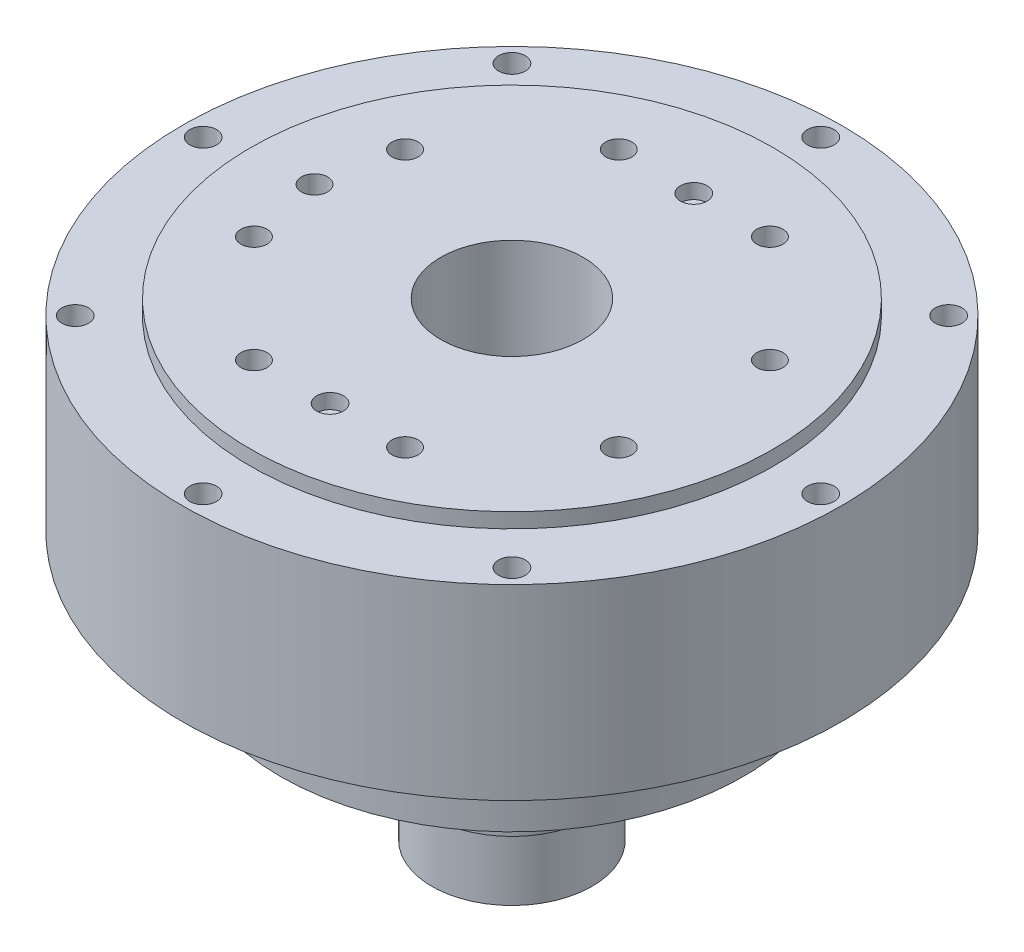
ISO-10303-21;
HEADER;
FILE_DESCRIPTION(('STEP AP214'),'2;1');
FILE_NAME('part.step','',(''),(''),'','','');
FILE_SCHEMA(('AUTOMOTIVE_DESIGN { 1 0 10303 214 1 1 1 1 }'));
ENDSEC;
DATA;
#1=APPLICATION_CONTEXT('core data for automotive mechanical design processes');
#2=APPLICATION_PROTOCOL_DEFINITION('international standard','automotive_design',2000,#1);
#3=PRODUCT_CONTEXT('',#1,'mechanical');
#4=PRODUCT('Part','Part','',(#3));
#5=PRODUCT_RELATED_PRODUCT_CATEGORY('part','',(#4));
#6=PRODUCT_DEFINITION_FORMATION('','',#4);
#7=PRODUCT_DEFINITION_CONTEXT('part definition',#1,'design');
#8=PRODUCT_DEFINITION('design','',#6,#7);
#9=PRODUCT_DEFINITION_SHAPE('','',#8);
#10=(LENGTH_UNIT() NAMED_UNIT(*) SI_UNIT(.MILLI.,.METRE.));
#11=(NAMED_UNIT(*) PLANE_ANGLE_UNIT() SI_UNIT($,.RADIAN.));
#12=(NAMED_UNIT(*) SI_UNIT($,.STERADIAN.) SOLID_ANGLE_UNIT());
#13=UNCERTAINTY_MEASURE_WITH_UNIT(LENGTH_MEASURE(1.E-05),#10,'distance_accuracy_value','');
#14=(GEOMETRIC_REPRESENTATION_CONTEXT(3) GLOBAL_UNCERTAINTY_ASSIGNED_CONTEXT((#13)) GLOBAL_UNIT_ASSIGNED_CONTEXT((#10,
#11,#12)) REPRESENTATION_CONTEXT('',''));
#15=CARTESIAN_POINT('',(0.,0.,0.));
#16=DIRECTION('',(0.,0.,1.));
#17=DIRECTION('',(1.,0.,0.));
#18=AXIS2_PLACEMENT_3D('',#15,#16,#17);
#19=CARTESIAN_POINT('',(0.,0.,0.));
#20=DIRECTION('',(0.,1.,0.));
#21=DIRECTION('',(0.,0.,1.));
#22=AXIS2_PLACEMENT_3D('',#19,#20,#21);
#23=PLANE('',#22);
#24=CARTESIAN_POINT('',(0.,0.,0.));
#25=DIRECTION('',(0.,-1.,0.));
#26=DIRECTION('',(0.,0.,-1.));
#27=AXIS2_PLACEMENT_3D('',#24,#25,#26);
#28=CIRCLE('',#27,24.);
#29=CARTESIAN_POINT('',(0.,0.,-24.));
#30=VERTEX_POINT('',#29);
#31=EDGE_CURVE('E213',#30,#30,#28,.T.);
#32=ORIENTED_EDGE('',*,*,#31,.F.);
#33=EDGE_LOOP('',(#32));
#34=FACE_BOUND('',#33,.T.);
#35=CARTESIAN_POINT('',(0.,0.,0.));
#36=DIRECTION('',(0.,-1.,0.));
#37=DIRECTION('',(0.,0.,-1.));
#38=AXIS2_PLACEMENT_3D('',#35,#36,#37);
#39=CIRCLE('',#38,27.);
#40=CARTESIAN_POINT('',(0.,0.,-27.));
#41=VERTEX_POINT('',#40);
#42=EDGE_CURVE('E10',#41,#41,#39,.T.);
#43=ORIENTED_EDGE('',*,*,#42,.T.);
#44=EDGE_LOOP('',(#43));
#45=FACE_BOUND('',#44,.T.);
#46=ADVANCED_FACE('F37',(#34,#45),#23,.F.);
#47=CARTESIAN_POINT('',(0.,0.,0.));
#48=DIRECTION('',(0.,-1.,0.));
#49=DIRECTION('',(0.,0.,-1.));
#50=AXIS2_PLACEMENT_3D('',#47,#48,#49);
#51=CYLINDRICAL_SURFACE('',#50,27.);
#52=ORIENTED_EDGE('',*,*,#42,.F.);
#53=EDGE_LOOP('',(#52));
#54=FACE_BOUND('',#53,.T.);
#55=CARTESIAN_POINT('',(0.,20.5,0.));
#56=DIRECTION('',(0.,-1.,0.));
#57=DIRECTION('',(0.,0.,-1.));
#58=AXIS2_PLACEMENT_3D('',#55,#56,#57);
#59=CIRCLE('',#58,27.);
#60=CARTESIAN_POINT('',(0.,20.5,-27.));
#61=VERTEX_POINT('',#60);
#62=EDGE_CURVE('E43',#61,#61,#59,.T.);
#63=ORIENTED_EDGE('',*,*,#62,.T.);
#64=EDGE_LOOP('',(#63));
#65=FACE_BOUND('',#64,.T.);
#66=ADVANCED_FACE('F230',(#54,#65),#51,.T.);
#67=CARTESIAN_POINT('',(0.,20.5,27.));
#68=DIRECTION('',(0.,1.,0.));
#69=DIRECTION('',(0.,0.,1.));
#70=AXIS2_PLACEMENT_3D('',#67,#68,#69);
#71=PLANE('',#70);
#72=ORIENTED_EDGE('',*,*,#62,.F.);
#73=EDGE_LOOP('',(#72));
#74=FACE_BOUND('',#73,.T.);
#75=CARTESIAN_POINT('',(0.,20.5,0.));
#76=DIRECTION('',(0.,-1.,0.));
#77=DIRECTION('',(0.,0.,-1.));
#78=AXIS2_PLACEMENT_3D('',#75,#76,#77);
#79=CIRCLE('',#78,27.5);
#80=CARTESIAN_POINT('',(0.,20.5,-27.5));
#81=VERTEX_POINT('',#80);
#82=EDGE_CURVE('E47',#81,#81,#79,.T.);
#83=ORIENTED_EDGE('',*,*,#82,.T.);
#84=EDGE_LOOP('',(#83));
#85=FACE_BOUND('',#84,.T.);
#86=ADVANCED_FACE('F234',(#74,#85),#71,.F.);
#87=CARTESIAN_POINT('',(0.,0.,0.));
#88=DIRECTION('',(0.,-1.,0.));
#89=DIRECTION('',(0.,0.,-1.));
#90=AXIS2_PLACEMENT_3D('',#87,#88,#89);
#91=CYLINDRICAL_SURFACE('',#90,27.5);
#92=ORIENTED_EDGE('',*,*,#82,.F.);
#93=EDGE_LOOP('',(#92));
#94=FACE_BOUND('',#93,.T.);
#95=CARTESIAN_POINT('',(0.,45.55,0.));
#96=DIRECTION('',(0.,-1.,0.));
#97=DIRECTION('',(0.,0.,-1.));
#98=AXIS2_PLACEMENT_3D('',#95,#96,#97);
#99=CIRCLE('',#98,27.5);
#100=CARTESIAN_POINT('',(0.,45.55,-27.5));
#101=VERTEX_POINT('',#100);
#102=EDGE_CURVE('E51',#101,#101,#99,.T.);
#103=ORIENTED_EDGE('',*,*,#102,.T.);
#104=EDGE_LOOP('',(#103));
#105=FACE_BOUND('',#104,.T.);
#106=ADVANCED_FACE('F239',(#94,#105),#91,.T.);
#107=CARTESIAN_POINT('',(0.,45.55,27.5));
#108=DIRECTION('',(0.,1.,0.));
#109=DIRECTION('',(0.,0.,1.));
#110=AXIS2_PLACEMENT_3D('',#107,#108,#109);
#111=PLANE('',#110);
#112=ORIENTED_EDGE('',*,*,#102,.F.);
#113=EDGE_LOOP('',(#112));
#114=FACE_BOUND('',#113,.T.);
#115=CARTESIAN_POINT('',(0.,45.55,0.));
#116=DIRECTION('',(0.,-1.,0.));
#117=DIRECTION('',(0.,0.,-1.));
#118=AXIS2_PLACEMENT_3D('',#115,#116,#117);
#119=CIRCLE('',#118,42.5);
#120=CARTESIAN_POINT('',(0.,45.55,-42.5));
#121=VERTEX_POINT('',#120);
#122=EDGE_CURVE('E56',#121,#121,#119,.T.);
#123=ORIENTED_EDGE('',*,*,#122,.T.);
#124=EDGE_LOOP('',(#123));
#125=FACE_BOUND('',#124,.T.);
#126=ADVANCED_FACE('F245',(#114,#125),#111,.F.);
#127=CARTESIAN_POINT('',(0.,0.,0.));
#128=DIRECTION('',(0.,-1.,0.));
#129=DIRECTION('',(0.,0.,-1.));
#130=AXIS2_PLACEMENT_3D('',#127,#128,#129);
#131=CYLINDRICAL_SURFACE('',#130,42.5);
#132=ORIENTED_EDGE('',*,*,#122,.F.);
#133=EDGE_LOOP('',(#132));
#134=FACE_BOUND('',#133,.T.);
#135=CARTESIAN_POINT('',(0.,57.55,0.));
#136=DIRECTION('',(0.,-1.,0.));
#137=DIRECTION('',(0.,0.,-1.));
#138=AXIS2_PLACEMENT_3D('',#135,#136,#137);
#139=CIRCLE('',#138,42.5);
#140=CARTESIAN_POINT('',(0.,57.55,-42.5));
#141=VERTEX_POINT('',#140);
#142=EDGE_CURVE('E59',#141,#141,#139,.T.);
#143=ORIENTED_EDGE('',*,*,#142,.T.);
#144=EDGE_LOOP('',(#143));
#145=FACE_BOUND('',#144,.T.);
#146=ADVANCED_FACE('F249',(#134,#145),#131,.T.);
#147=CARTESIAN_POINT('',(0.,57.55,42.5));
#148=DIRECTION('',(0.,1.,0.));
#149=DIRECTION('',(0.,0.,1.));
#150=AXIS2_PLACEMENT_3D('',#147,#148,#149);
#151=PLANE('',#150);
#152=ORIENTED_EDGE('',*,*,#142,.F.);
#153=EDGE_LOOP('',(#152));
#154=FACE_BOUND('',#153,.T.);
#155=CARTESIAN_POINT('',(0.,57.55,0.));
#156=DIRECTION('',(0.,-1.,0.));
#157=DIRECTION('',(0.,0.,-1.));
#158=AXIS2_PLACEMENT_3D('',#155,#156,#157);
#159=CIRCLE('',#158,78.);
#160=CARTESIAN_POINT('',(0.,57.55,-78.));
#161=VERTEX_POINT('',#160);
#162=EDGE_CURVE('E62',#161,#161,#159,.T.);
#163=ORIENTED_EDGE('',*,*,#162,.T.);
#164=EDGE_LOOP('',(#163));
#165=FACE_BOUND('',#164,.T.);
#166=ADVANCED_FACE('F253',(#154,#165),#151,.F.);
#167=CARTESIAN_POINT('',(0.,0.,0.));
#168=DIRECTION('',(0.,-1.,0.));
#169=DIRECTION('',(0.,0.,-1.));
#170=AXIS2_PLACEMENT_3D('',#167,#168,#169);
#171=CYLINDRICAL_SURFACE('',#170,78.);
#172=ORIENTED_EDGE('',*,*,#162,.F.);
#173=EDGE_LOOP('',(#172));
#174=FACE_BOUND('',#173,.T.);
#175=CARTESIAN_POINT('',(0.,67.8430050880201,0.));
#176=DIRECTION('',(0.,-1.,0.));
#177=DIRECTION('',(0.,0.,-1.));
#178=AXIS2_PLACEMENT_3D('',#175,#176,#177);
#179=CIRCLE('',#178,78.);
#180=CARTESIAN_POINT('',(0.,67.8430050880201,-78.));
#181=VERTEX_POINT('',#180);
#182=EDGE_CURVE('E65',#181,#181,#179,.T.);
#183=ORIENTED_EDGE('',*,*,#182,.T.);
#184=EDGE_LOOP('',(#183));
#185=FACE_BOUND('',#184,.T.);
#186=ADVANCED_FACE('F257',(#174,#185),#171,.T.);
#187=CARTESIAN_POINT('',(0.,67.8430050880201,78.));
#188=DIRECTION('',(0.,-1.,0.));
#189=DIRECTION('',(0.,0.,-1.));
#190=AXIS2_PLACEMENT_3D('',#187,#188,#189);
#191=PLANE('',#190);
#192=ORIENTED_EDGE('',*,*,#182,.F.);
#193=EDGE_LOOP('',(#192));
#194=FACE_BOUND('',#193,.T.);
#195=CARTESIAN_POINT('',(0.,67.8430050880201,0.));
#196=DIRECTION('',(0.,-1.,0.));
#197=DIRECTION('',(0.,0.,-1.));
#198=AXIS2_PLACEMENT_3D('',#195,#196,#197);
#199=CIRCLE('',#198,42.9118558687993);
#200=CARTESIAN_POINT('',(0.,67.8430050880201,-42.9118558687993));
#201=VERTEX_POINT('',#200);
#202=EDGE_CURVE('E68',#201,#201,#199,.T.);
#203=ORIENTED_EDGE('',*,*,#202,.T.);
#204=EDGE_LOOP('',(#203));
#205=FACE_BOUND('',#204,.T.);
#206=ADVANCED_FACE('F261',(#194,#205),#191,.F.);
#207=CARTESIAN_POINT('',(0.,0.,0.));
#208=DIRECTION('',(0.,-1.,0.));
#209=DIRECTION('',(0.,0.,-1.));
#210=AXIS2_PLACEMENT_3D('',#207,#208,#209);
#211=CYLINDRICAL_SURFACE('',#210,42.9118558687993);
#212=ORIENTED_EDGE('',*,*,#202,.F.);
#213=EDGE_LOOP('',(#212));
#214=FACE_BOUND('',#213,.T.);
#215=CARTESIAN_POINT('',(0.,74.5688263856512,0.));
#216=DIRECTION('',(0.,-1.,0.));
#217=DIRECTION('',(0.,0.,-1.));
#218=AXIS2_PLACEMENT_3D('',#215,#216,#217);
#219=CIRCLE('',#218,42.9118558687993);
#220=CARTESIAN_POINT('',(0.,74.5688263856512,-42.9118558687993));
#221=VERTEX_POINT('',#220);
#222=EDGE_CURVE('E71',#221,#221,#219,.T.);
#223=ORIENTED_EDGE('',*,*,#222,.T.);
#224=EDGE_LOOP('',(#223));
#225=FACE_BOUND('',#224,.T.);
#226=ADVANCED_FACE('F265',(#214,#225),#211,.T.);
#227=CARTESIAN_POINT('',(0.,74.5688263856512,42.9118558687993));
#228=DIRECTION('',(0.,1.,0.));
#229=DIRECTION('',(0.,0.,1.));
#230=AXIS2_PLACEMENT_3D('',#227,#228,#229);
#231=PLANE('',#230);
#232=ORIENTED_EDGE('',*,*,#222,.F.);
#233=EDGE_LOOP('',(#232));
#234=FACE_BOUND('',#233,.T.);
#235=CARTESIAN_POINT('',(0.,74.5688263856512,0.));
#236=DIRECTION('',(0.,-1.,0.));
#237=DIRECTION('',(0.,0.,-1.));
#238=AXIS2_PLACEMENT_3D('',#235,#236,#237);
#239=CIRCLE('',#238,50.1462036607056);
#240=CARTESIAN_POINT('',(0.,74.5688263856512,-50.1462036607056));
#241=VERTEX_POINT('',#240);
#242=EDGE_CURVE('E74',#241,#241,#239,.T.);
#243=ORIENTED_EDGE('',*,*,#242,.T.);
#244=EDGE_LOOP('',(#243));
#245=FACE_BOUND('',#244,.T.);
#246=ADVANCED_FACE('F269',(#234,#245),#231,.F.);
#247=CARTESIAN_POINT('',(0.,0.,0.));
#248=DIRECTION('',(0.,-1.,0.));
#249=DIRECTION('',(0.,0.,-1.));
#250=AXIS2_PLACEMENT_3D('',#247,#248,#249);
#251=CYLINDRICAL_SURFACE('',#250,50.1462036607056);
#252=ORIENTED_EDGE('',*,*,#242,.F.);
#253=EDGE_LOOP('',(#252));
#254=FACE_BOUND('',#253,.T.);
#255=CARTESIAN_POINT('',(0.,79.,0.));
#256=DIRECTION('',(0.,-1.,0.));
#257=DIRECTION('',(0.,0.,-1.));
#258=AXIS2_PLACEMENT_3D('',#255,#256,#257);
#259=CIRCLE('',#258,50.1462036607056);
#260=CARTESIAN_POINT('',(0.,79.,-50.1462036607056));
#261=VERTEX_POINT('',#260);
#262=EDGE_CURVE('E77',#261,#261,#259,.T.);
#263=ORIENTED_EDGE('',*,*,#262,.T.);
#264=EDGE_LOOP('',(#263));
#265=FACE_BOUND('',#264,.T.);
#266=ADVANCED_FACE('F273',(#254,#265),#251,.T.);
#267=CARTESIAN_POINT('',(0.,79.,50.1462036607056));
#268=DIRECTION('',(0.,1.,0.));
#269=DIRECTION('',(0.,0.,1.));
#270=AXIS2_PLACEMENT_3D('',#267,#268,#269);
#271=PLANE('',#270);
#272=ORIENTED_EDGE('',*,*,#262,.F.);
#273=EDGE_LOOP('',(#272));
#274=FACE_BOUND('',#273,.T.);
#275=CARTESIAN_POINT('',(0.,79.,0.));
#276=DIRECTION('',(0.,-1.,0.));
#277=DIRECTION('',(0.,0.,-1.));
#278=AXIS2_PLACEMENT_3D('',#275,#276,#277);
#279=CIRCLE('',#278,85.75);
#280=CARTESIAN_POINT('',(0.,79.,-85.75));
#281=VERTEX_POINT('',#280);
#282=EDGE_CURVE('E80',#281,#281,#279,.T.);
#283=ORIENTED_EDGE('',*,*,#282,.T.);
#284=EDGE_LOOP('',(#283));
#285=FACE_BOUND('',#284,.T.);
#286=ADVANCED_FACE('F277',(#274,#285),#271,.F.);
#287=CARTESIAN_POINT('',(0.,0.,0.));
#288=DIRECTION('',(0.,-1.,0.));
#289=DIRECTION('',(0.,0.,-1.));
#290=AXIS2_PLACEMENT_3D('',#287,#288,#289);
#291=CYLINDRICAL_SURFACE('',#290,85.75);
#292=ORIENTED_EDGE('',*,*,#282,.F.);
#293=EDGE_LOOP('',(#292));
#294=FACE_BOUND('',#293,.T.);
#295=CARTESIAN_POINT('',(0.,90.,0.));
#296=DIRECTION('',(0.,-1.,0.));
#297=DIRECTION('',(0.,0.,-1.));
#298=AXIS2_PLACEMENT_3D('',#295,#296,#297);
#299=CIRCLE('',#298,85.75);
#300=CARTESIAN_POINT('',(0.,90.,-85.75));
#301=VERTEX_POINT('',#300);
#302=EDGE_CURVE('E83',#301,#301,#299,.T.);
#303=ORIENTED_EDGE('',*,*,#302,.T.);
#304=EDGE_LOOP('',(#303));
#305=FACE_BOUND('',#304,.T.);
#306=ADVANCED_FACE('F281',(#294,#305),#291,.T.);
#307=CARTESIAN_POINT('',(0.,90.,85.75));
#308=DIRECTION('',(0.,1.,0.));
#309=DIRECTION('',(0.,0.,1.));
#310=AXIS2_PLACEMENT_3D('',#307,#308,#309);
#311=PLANE('',#310);
#312=CARTESIAN_POINT('',(-104.,90.,0.));
#313=DIRECTION('',(0.,1.,0.));
#314=DIRECTION('',(0.,0.,1.));
#315=AXIS2_PLACEMENT_3D('',#312,#313,#314);
#316=CIRCLE('',#315,4.5);
#317=CARTESIAN_POINT('',(-104.,90.,4.5));
#318=VERTEX_POINT('',#317);
#319=EDGE_CURVE('E98',#318,#318,#316,.T.);
#320=ORIENTED_EDGE('',*,*,#319,.T.);
#321=EDGE_LOOP('',(#320));
#322=FACE_BOUND('',#321,.T.);
#323=CARTESIAN_POINT('',(-73.5391052434009,90.,-73.5391052434009));
#324=DIRECTION('',(0.,1.,0.));
#325=DIRECTION('',(0.,0.,1.));
#326=AXIS2_PLACEMENT_3D('',#323,#324,#325);
#327=CIRCLE('',#326,4.50000000000017);
#328=CARTESIAN_POINT('',(-73.5391052434009,90.,-69.0391052434008));
#329=VERTEX_POINT('',#328);
#330=EDGE_CURVE('E101',#329,#329,#327,.T.);
#331=ORIENTED_EDGE('',*,*,#330,.T.);
#332=EDGE_LOOP('',(#331));
#333=FACE_BOUND('',#332,.T.);
#334=CARTESIAN_POINT('',(3.63114059239686E-13,90.,-104.));
#335=DIRECTION('',(0.,1.,0.));
#336=DIRECTION('',(0.,0.,1.));
#337=AXIS2_PLACEMENT_3D('',#334,#335,#336);
#338=CIRCLE('',#337,4.5);
#339=CARTESIAN_POINT('',(3.63114059239686E-13,90.,-99.5));
#340=VERTEX_POINT('',#339);
#341=EDGE_CURVE('E104',#340,#340,#338,.T.);
#342=ORIENTED_EDGE('',*,*,#341,.T.);
#343=EDGE_LOOP('',(#342));
#344=FACE_BOUND('',#343,.T.);
#345=CARTESIAN_POINT('',(73.5391052434013,90.,-73.5391052434006));
#346=DIRECTION('',(0.,1.,0.));
#347=DIRECTION('',(0.,0.,1.));
#348=AXIS2_PLACEMENT_3D('',#345,#346,#347);
#349=CIRCLE('',#348,4.50000000000001);
#350=CARTESIAN_POINT('',(73.5391052434013,90.,-69.0391052434006));
#351=VERTEX_POINT('',#350);
#352=EDGE_CURVE('E107',#351,#351,#349,.T.);
#353=ORIENTED_EDGE('',*,*,#352,.T.);
#354=EDGE_LOOP('',(#353));
#355=FACE_BOUND('',#354,.T.);
#356=CARTESIAN_POINT('',(104.,90.,7.26228118479372E-13));
#357=DIRECTION('',(0.,1.,0.));
#358=DIRECTION('',(0.,0.,1.));
#359=AXIS2_PLACEMENT_3D('',#356,#357,#358);
#360=CIRCLE('',#359,4.5);
#361=CARTESIAN_POINT('',(104.,90.,4.50000000000073));
#362=VERTEX_POINT('',#361);
#363=EDGE_CURVE('E110',#362,#362,#360,.T.);
#364=ORIENTED_EDGE('',*,*,#363,.T.);
#365=EDGE_LOOP('',(#364));
#366=FACE_BOUND('',#365,.T.);
#367=CARTESIAN_POINT('',(73.5391052434003,90.,73.5391052434016));
#368=DIRECTION('',(0.,1.,0.));
#369=DIRECTION('',(0.,0.,1.));
#370=AXIS2_PLACEMENT_3D('',#367,#368,#369);
#371=CIRCLE('',#370,4.50000000000001);
#372=CARTESIAN_POINT('',(73.5391052434003,90.,78.0391052434016));
#373=VERTEX_POINT('',#372);
#374=EDGE_CURVE('E113',#373,#373,#371,.T.);
#375=ORIENTED_EDGE('',*,*,#374,.T.);
#376=EDGE_LOOP('',(#375));
#377=FACE_BOUND('',#376,.T.);
#378=CARTESIAN_POINT('',(-1.08934217771906E-12,90.,104.));
#379=DIRECTION('',(0.,1.,0.));
#380=DIRECTION('',(0.,0.,1.));
#381=AXIS2_PLACEMENT_3D('',#378,#379,#380);
#382=CIRCLE('',#381,4.5);
#383=CARTESIAN_POINT('',(-1.08934217771906E-12,90.,108.5));
#384=VERTEX_POINT('',#383);
#385=EDGE_CURVE('E116',#384,#384,#382,.T.);
#386=ORIENTED_EDGE('',*,*,#385,.T.);
#387=EDGE_LOOP('',(#386));
#388=FACE_BOUND('',#387,.T.);
#389=CARTESIAN_POINT('',(-73.5391052434009,90.,73.539105243401));
#390=DIRECTION('',(0.,1.,0.));
#391=DIRECTION('',(0.,0.,1.));
#392=AXIS2_PLACEMENT_3D('',#389,#390,#391);
#393=CIRCLE('',#392,4.49999999999942);
#394=CARTESIAN_POINT('',(-73.5391052434009,90.,78.0391052434004));
#395=VERTEX_POINT('',#394);
#396=EDGE_CURVE('E119',#395,#395,#393,.T.);
#397=ORIENTED_EDGE('',*,*,#396,.T.);
#398=EDGE_LOOP('',(#397));
#399=FACE_BOUND('',#398,.T.);
#400=ORIENTED_EDGE('',*,*,#302,.F.);
#401=EDGE_LOOP('',(#400));
#402=FACE_BOUND('',#401,.T.);
#403=CARTESIAN_POINT('',(0.,90.,0.));
#404=DIRECTION('',(0.,-1.,0.));
#405=DIRECTION('',(0.,0.,-1.));
#406=AXIS2_PLACEMENT_3D('',#403,#404,#405);
#407=CIRCLE('',#406,111.);
#408=CARTESIAN_POINT('',(0.,90.,-111.));
#409=VERTEX_POINT('',#408);
#410=EDGE_CURVE('E86',#409,#409,#407,.T.);
#411=ORIENTED_EDGE('',*,*,#410,.T.);
#412=EDGE_LOOP('',(#411));
#413=FACE_BOUND('',#412,.T.);
#414=ADVANCED_FACE('F285',(#322,#333,#344,#355,#366,#377,#388,#399,#402,#413),#311,.F.);
#415=CARTESIAN_POINT('',(0.,0.,0.));
#416=DIRECTION('',(0.,-1.,0.));
#417=DIRECTION('',(0.,0.,-1.));
#418=AXIS2_PLACEMENT_3D('',#415,#416,#417);
#419=CYLINDRICAL_SURFACE('',#418,111.);
#420=ORIENTED_EDGE('',*,*,#410,.F.);
#421=EDGE_LOOP('',(#420));
#422=FACE_BOUND('',#421,.T.);
#423=CARTESIAN_POINT('',(0.,153.,0.));
#424=DIRECTION('',(0.,-1.,0.));
#425=DIRECTION('',(0.,0.,-1.));
#426=AXIS2_PLACEMENT_3D('',#423,#424,#425);
#427=CIRCLE('',#426,111.);
#428=CARTESIAN_POINT('',(0.,153.,-111.));
#429=VERTEX_POINT('',#428);
#430=EDGE_CURVE('E89',#429,#429,#427,.T.);
#431=ORIENTED_EDGE('',*,*,#430,.T.);
#432=EDGE_LOOP('',(#431));
#433=FACE_BOUND('',#432,.T.);
#434=ADVANCED_FACE('F289',(#422,#433),#419,.T.);
#435=CARTESIAN_POINT('',(0.,153.,111.));
#436=DIRECTION('',(0.,-1.,0.));
#437=DIRECTION('',(0.,0.,-1.));
#438=AXIS2_PLACEMENT_3D('',#435,#436,#437);
#439=PLANE('',#438);
#440=CARTESIAN_POINT('',(-104.,153.,0.));
#441=DIRECTION('',(0.,1.,0.));
#442=DIRECTION('',(0.,0.,1.));
#443=AXIS2_PLACEMENT_3D('',#440,#441,#442);
#444=CIRCLE('',#443,4.5);
#445=CARTESIAN_POINT('',(-104.,153.,4.5));
#446=VERTEX_POINT('',#445);
#447=EDGE_CURVE('E122',#446,#446,#444,.T.);
#448=ORIENTED_EDGE('',*,*,#447,.F.);
#449=EDGE_LOOP('',(#448));
#450=FACE_BOUND('',#449,.T.);
#451=CARTESIAN_POINT('',(-73.5391052434009,153.,-73.5391052434009));
#452=DIRECTION('',(0.,1.,0.));
#453=DIRECTION('',(0.,0.,1.));
#454=AXIS2_PLACEMENT_3D('',#451,#452,#453);
#455=CIRCLE('',#454,4.50000000000017);
#456=CARTESIAN_POINT('',(-73.5391052434009,153.,-69.0391052434008));
#457=VERTEX_POINT('',#456);
#458=EDGE_CURVE('E142',#457,#457,#455,.T.);
#459=ORIENTED_EDGE('',*,*,#458,.F.);
#460=EDGE_LOOP('',(#459));
#461=FACE_BOUND('',#460,.T.);
#462=CARTESIAN_POINT('',(3.63114059239686E-13,153.,-104.));
#463=DIRECTION('',(0.,1.,0.));
#464=DIRECTION('',(0.,0.,1.));
#465=AXIS2_PLACEMENT_3D('',#462,#463,#464);
#466=CIRCLE('',#465,4.5);
#467=CARTESIAN_POINT('',(3.63114059239686E-13,153.,-99.5));
#468=VERTEX_POINT('',#467);
#469=EDGE_CURVE('E139',#468,#468,#466,.T.);
#470=ORIENTED_EDGE('',*,*,#469,.F.);
#471=EDGE_LOOP('',(#470));
#472=FACE_BOUND('',#471,.T.);
#473=CARTESIAN_POINT('',(73.5391052434013,153.,-73.5391052434006));
#474=DIRECTION('',(0.,1.,0.));
#475=DIRECTION('',(0.,0.,1.));
#476=AXIS2_PLACEMENT_3D('',#473,#474,#475);
#477=CIRCLE('',#476,4.50000000000001);
#478=CARTESIAN_POINT('',(73.5391052434013,153.,-69.0391052434006));
#479=VERTEX_POINT('',#478);
#480=EDGE_CURVE('E136',#479,#479,#477,.T.);
#481=ORIENTED_EDGE('',*,*,#480,.F.);
#482=EDGE_LOOP('',(#481));
#483=FACE_BOUND('',#482,.T.);
#484=CARTESIAN_POINT('',(104.,153.,7.26228118479372E-13));
#485=DIRECTION('',(0.,1.,0.));
#486=DIRECTION('',(0.,0.,1.));
#487=AXIS2_PLACEMENT_3D('',#484,#485,#486);
#488=CIRCLE('',#487,4.5);
#489=CARTESIAN_POINT('',(104.,153.,4.50000000000073));
#490=VERTEX_POINT('',#489);
#491=EDGE_CURVE('E133',#490,#490,#488,.T.);
#492=ORIENTED_EDGE('',*,*,#491,.F.);
#493=EDGE_LOOP('',(#492));
#494=FACE_BOUND('',#493,.T.);
#495=CARTESIAN_POINT('',(73.5391052434003,153.,73.5391052434016));
#496=DIRECTION('',(0.,1.,0.));
#497=DIRECTION('',(0.,0.,1.));
#498=AXIS2_PLACEMENT_3D('',#495,#496,#497);
#499=CIRCLE('',#498,4.50000000000001);
#500=CARTESIAN_POINT('',(73.5391052434003,153.,78.0391052434016));
#501=VERTEX_POINT('',#500);
#502=EDGE_CURVE('E130',#501,#501,#499,.T.);
#503=ORIENTED_EDGE('',*,*,#502,.F.);
#504=EDGE_LOOP('',(#503));
#505=FACE_BOUND('',#504,.T.);
#506=CARTESIAN_POINT('',(-1.08934217771906E-12,153.,104.));
#507=DIRECTION('',(0.,1.,0.));
#508=DIRECTION('',(0.,0.,1.));
#509=AXIS2_PLACEMENT_3D('',#506,#507,#508);
#510=CIRCLE('',#509,4.5);
#511=CARTESIAN_POINT('',(-1.08934217771906E-12,153.,108.5));
#512=VERTEX_POINT('',#511);
#513=EDGE_CURVE('E126',#512,#512,#510,.T.);
#514=ORIENTED_EDGE('',*,*,#513,.F.);
#515=EDGE_LOOP('',(#514));
#516=FACE_BOUND('',#515,.T.);
#517=CARTESIAN_POINT('',(-73.5391052434009,153.,73.539105243401));
#518=DIRECTION('',(0.,1.,0.));
#519=DIRECTION('',(0.,0.,1.));
#520=AXIS2_PLACEMENT_3D('',#517,#518,#519);
#521=CIRCLE('',#520,4.49999999999942);
#522=CARTESIAN_POINT('',(-73.5391052434009,153.,78.0391052434004));
#523=VERTEX_POINT('',#522);
#524=EDGE_CURVE('E123',#523,#523,#521,.T.);
#525=ORIENTED_EDGE('',*,*,#524,.F.);
#526=EDGE_LOOP('',(#525));
#527=FACE_BOUND('',#526,.T.);
#528=ORIENTED_EDGE('',*,*,#430,.F.);
#529=EDGE_LOOP('',(#528));
#530=FACE_BOUND('',#529,.T.);
#531=CARTESIAN_POINT('',(0.,153.,0.));
#532=DIRECTION('',(0.,-1.,0.));
#533=DIRECTION('',(0.,0.,-1.));
#534=AXIS2_PLACEMENT_3D('',#531,#532,#533);
#535=CIRCLE('',#534,87.9999999999997);
#536=CARTESIAN_POINT('',(0.,153.,-87.9999999999997));
#537=VERTEX_POINT('',#536);
#538=EDGE_CURVE('E92',#537,#537,#535,.T.);
#539=ORIENTED_EDGE('',*,*,#538,.T.);
#540=EDGE_LOOP('',(#539));
#541=FACE_BOUND('',#540,.T.);
#542=ADVANCED_FACE('F293',(#450,#461,#472,#483,#494,#505,#516,#527,#530,#541),#439,.F.);
#543=CARTESIAN_POINT('',(0.,0.,0.));
#544=DIRECTION('',(0.,-1.,0.));
#545=DIRECTION('',(0.,0.,-1.));
#546=AXIS2_PLACEMENT_3D('',#543,#544,#545);
#547=CYLINDRICAL_SURFACE('',#546,87.9999999999997);
#548=ORIENTED_EDGE('',*,*,#538,.F.);
#549=EDGE_LOOP('',(#548));
#550=FACE_BOUND('',#549,.T.);
#551=CARTESIAN_POINT('',(0.,158.,0.));
#552=DIRECTION('',(0.,-1.,0.));
#553=DIRECTION('',(0.,0.,-1.));
#554=AXIS2_PLACEMENT_3D('',#551,#552,#553);
#555=CIRCLE('',#554,87.9999999999997);
#556=CARTESIAN_POINT('',(0.,158.,-87.9999999999997));
#557=VERTEX_POINT('',#556);
#558=EDGE_CURVE('E95',#557,#557,#555,.T.);
#559=ORIENTED_EDGE('',*,*,#558,.T.);
#560=EDGE_LOOP('',(#559));
#561=FACE_BOUND('',#560,.T.);
#562=ADVANCED_FACE('F297',(#550,#561),#547,.T.);
#563=CARTESIAN_POINT('',(0.,158.,87.9999999999997));
#564=DIRECTION('',(0.,-1.,0.));
#565=DIRECTION('',(0.,0.,-1.));
#566=AXIS2_PLACEMENT_3D('',#563,#564,#565);
#567=PLANE('',#566);
#568=CARTESIAN_POINT('',(0.,158.,0.));
#569=DIRECTION('',(0.,-1.,0.));
#570=DIRECTION('',(0.,0.,-1.));
#571=AXIS2_PLACEMENT_3D('',#568,#569,#570);
#572=CIRCLE('',#571,24.);
#573=CARTESIAN_POINT('',(0.,158.,-24.));
#574=VERTEX_POINT('',#573);
#575=EDGE_CURVE('E205',#574,#574,#572,.T.);
#576=ORIENTED_EDGE('',*,*,#575,.T.);
#577=EDGE_LOOP('',(#576));
#578=FACE_BOUND('',#577,.T.);
#579=CARTESIAN_POINT('',(0.,158.,61.25));
#580=DIRECTION('',(0.,1.,0.));
#581=DIRECTION('',(0.,0.,1.));
#582=AXIS2_PLACEMENT_3D('',#579,#580,#581);
#583=CIRCLE('',#582,4.5);
#584=CARTESIAN_POINT('',(0.,158.,65.75));
#585=VERTEX_POINT('',#584);
#586=EDGE_CURVE('E208',#585,#585,#583,.T.);
#587=ORIENTED_EDGE('',*,*,#586,.F.);
#588=EDGE_LOOP('',(#587));
#589=FACE_BOUND('',#588,.T.);
#590=CARTESIAN_POINT('',(4.27706464008284E-13,158.,-61.25));
#591=DIRECTION('',(0.,1.,0.));
#592=DIRECTION('',(0.,0.,1.));
#593=AXIS2_PLACEMENT_3D('',#590,#591,#592);
#594=CIRCLE('',#593,4.5);
#595=CARTESIAN_POINT('',(4.27706464008284E-13,158.,-56.75));
#596=VERTEX_POINT('',#595);
#597=EDGE_CURVE('E201',#596,#596,#594,.T.);
#598=ORIENTED_EDGE('',*,*,#597,.F.);
#599=EDGE_LOOP('',(#598));
#600=FACE_BOUND('',#599,.T.);
#601=CARTESIAN_POINT('',(-61.4379889120008,158.,25.4484482522779));
#602=DIRECTION('',(0.,1.,0.));
#603=DIRECTION('',(0.,0.,1.));
#604=AXIS2_PLACEMENT_3D('',#601,#602,#603);
#605=CIRCLE('',#604,4.4);
#606=CARTESIAN_POINT('',(-61.4379889120008,158.,29.8484482522779));
#607=VERTEX_POINT('',#606);
#608=EDGE_CURVE('E153',#607,#607,#605,.T.);
#609=ORIENTED_EDGE('',*,*,#608,.F.);
#610=EDGE_LOOP('',(#609));
#611=FACE_BOUND('',#610,.T.);
#612=CARTESIAN_POINT('',(-25.448448252279,158.,61.4379889120004));
#613=DIRECTION('',(0.,1.,0.));
#614=DIRECTION('',(0.,0.,1.));
#615=AXIS2_PLACEMENT_3D('',#612,#613,#614);
#616=CIRCLE('',#615,4.4);
#617=CARTESIAN_POINT('',(-25.448448252279,158.,65.8379889120004));
#618=VERTEX_POINT('',#617);
#619=EDGE_CURVE('E160',#618,#618,#616,.T.);
#620=ORIENTED_EDGE('',*,*,#619,.F.);
#621=EDGE_LOOP('',(#620));
#622=FACE_BOUND('',#621,.T.);
#623=CARTESIAN_POINT('',(25.448448252278,158.,61.4379889120008));
#624=DIRECTION('',(0.,1.,0.));
#625=DIRECTION('',(0.,0.,1.));
#626=AXIS2_PLACEMENT_3D('',#623,#624,#625);
#627=CIRCLE('',#626,4.4);
#628=CARTESIAN_POINT('',(25.448448252278,158.,65.8379889120008));
#629=VERTEX_POINT('',#628);
#630=EDGE_CURVE('E166',#629,#629,#627,.T.);
#631=ORIENTED_EDGE('',*,*,#630,.F.);
#632=EDGE_LOOP('',(#631));
#633=FACE_BOUND('',#632,.T.);
#634=CARTESIAN_POINT('',(61.4379889120004,158.,25.4484482522788));
#635=DIRECTION('',(0.,1.,0.));
#636=DIRECTION('',(0.,0.,1.));
#637=AXIS2_PLACEMENT_3D('',#634,#635,#636);
#638=CIRCLE('',#637,4.39999999999998);
#639=CARTESIAN_POINT('',(61.4379889120004,158.,29.8484482522788));
#640=VERTEX_POINT('',#639);
#641=EDGE_CURVE('E172',#640,#640,#638,.T.);
#642=ORIENTED_EDGE('',*,*,#641,.F.);
#643=EDGE_LOOP('',(#642));
#644=FACE_BOUND('',#643,.T.);
#645=CARTESIAN_POINT('',(61.4379889120007,158.,-25.4484482522782));
#646=DIRECTION('',(0.,1.,0.));
#647=DIRECTION('',(0.,0.,1.));
#648=AXIS2_PLACEMENT_3D('',#645,#646,#647);
#649=CIRCLE('',#648,4.4);
#650=CARTESIAN_POINT('',(61.4379889120007,158.,-21.0484482522782));
#651=VERTEX_POINT('',#650);
#652=EDGE_CURVE('E178',#651,#651,#649,.T.);
#653=ORIENTED_EDGE('',*,*,#652,.F.);
#654=EDGE_LOOP('',(#653));
#655=FACE_BOUND('',#654,.T.);
#656=CARTESIAN_POINT('',(25.4484482522787,158.,-61.4379889120005));
#657=DIRECTION('',(0.,1.,0.));
#658=DIRECTION('',(0.,0.,1.));
#659=AXIS2_PLACEMENT_3D('',#656,#657,#658);
#660=CIRCLE('',#659,4.4);
#661=CARTESIAN_POINT('',(25.4484482522787,158.,-57.0379889120005));
#662=VERTEX_POINT('',#661);
#663=EDGE_CURVE('E184',#662,#662,#660,.T.);
#664=ORIENTED_EDGE('',*,*,#663,.F.);
#665=EDGE_LOOP('',(#664));
#666=FACE_BOUND('',#665,.T.);
#667=CARTESIAN_POINT('',(-25.4484482522783,158.,-61.4379889120006));
#668=DIRECTION('',(0.,1.,0.));
#669=DIRECTION('',(0.,0.,1.));
#670=AXIS2_PLACEMENT_3D('',#667,#668,#669);
#671=CIRCLE('',#670,4.4);
#672=CARTESIAN_POINT('',(-25.4484482522783,158.,-57.0379889120006));
#673=VERTEX_POINT('',#672);
#674=EDGE_CURVE('E190',#673,#673,#671,.T.);
#675=ORIENTED_EDGE('',*,*,#674,.F.);
#676=EDGE_LOOP('',(#675));
#677=FACE_BOUND('',#676,.T.);
#678=CARTESIAN_POINT('',(-61.4379889120006,158.,-25.4484482522785));
#679=DIRECTION('',(0.,1.,0.));
#680=DIRECTION('',(0.,0.,1.));
#681=AXIS2_PLACEMENT_3D('',#678,#679,#680);
#682=CIRCLE('',#681,4.4);
#683=CARTESIAN_POINT('',(-61.4379889120006,158.,-21.0484482522785));
#684=VERTEX_POINT('',#683);
#685=EDGE_CURVE('E196',#684,#684,#682,.T.);
#686=ORIENTED_EDGE('',*,*,#685,.F.);
#687=EDGE_LOOP('',(#686));
#688=FACE_BOUND('',#687,.T.);
#689=CARTESIAN_POINT('',(-66.5,158.,0.));
#690=DIRECTION('',(0.,1.,0.));
#691=DIRECTION('',(0.,0.,1.));
#692=AXIS2_PLACEMENT_3D('',#689,#690,#691);
#693=CIRCLE('',#692,4.4);
#694=CARTESIAN_POINT('',(-66.5,158.,4.4));
#695=VERTEX_POINT('',#694);
#696=EDGE_CURVE('E147',#695,#695,#693,.T.);
#697=ORIENTED_EDGE('',*,*,#696,.F.);
#698=EDGE_LOOP('',(#697));
#699=FACE_BOUND('',#698,.T.);
#700=ORIENTED_EDGE('',*,*,#558,.F.);
#701=EDGE_LOOP('',(#700));
#702=FACE_BOUND('',#701,.T.);
#703=ADVANCED_FACE('F219',(#578,#589,#600,#611,#622,#633,#644,#655,#666,#677,#688,#699,#702),
#567,.F.);
#704=CARTESIAN_POINT('',(-73.5391052434009,0.,73.539105243401));
#705=DIRECTION('',(0.,1.,0.));
#706=DIRECTION('',(0.,0.,1.));
#707=AXIS2_PLACEMENT_3D('',#704,#705,#706);
#708=CYLINDRICAL_SURFACE('',#707,4.49999999999942);
#709=ORIENTED_EDGE('',*,*,#524,.T.);
#710=EDGE_LOOP('',(#709));
#711=FACE_BOUND('',#710,.T.);
#712=ORIENTED_EDGE('',*,*,#396,.F.);
#713=EDGE_LOOP('',(#712));
#714=FACE_BOUND('',#713,.T.);
#715=ADVANCED_FACE('F304',(#711,#714),#708,.F.);
#716=CARTESIAN_POINT('',(-1.08934217771906E-12,0.,104.));
#717=DIRECTION('',(0.,1.,0.));
#718=DIRECTION('',(0.,0.,1.));
#719=AXIS2_PLACEMENT_3D('',#716,#717,#718);
#720=CYLINDRICAL_SURFACE('',#719,4.5);
#721=ORIENTED_EDGE('',*,*,#513,.T.);
#722=EDGE_LOOP('',(#721));
#723=FACE_BOUND('',#722,.T.);
#724=ORIENTED_EDGE('',*,*,#385,.F.);
#725=EDGE_LOOP('',(#724));
#726=FACE_BOUND('',#725,.T.);
#727=ADVANCED_FACE('F307',(#723,#726),#720,.F.);
#728=CARTESIAN_POINT('',(73.5391052434003,0.,73.5391052434016));
#729=DIRECTION('',(0.,1.,0.));
#730=DIRECTION('',(0.,0.,1.));
#731=AXIS2_PLACEMENT_3D('',#728,#729,#730);
#732=CYLINDRICAL_SURFACE('',#731,4.50000000000001);
#733=ORIENTED_EDGE('',*,*,#502,.T.);
#734=EDGE_LOOP('',(#733));
#735=FACE_BOUND('',#734,.T.);
#736=ORIENTED_EDGE('',*,*,#374,.F.);
#737=EDGE_LOOP('',(#736));
#738=FACE_BOUND('',#737,.T.);
#739=ADVANCED_FACE('F311',(#735,#738),#732,.F.);
#740=CARTESIAN_POINT('',(104.,0.,7.26228118479372E-13));
#741=DIRECTION('',(0.,1.,0.));
#742=DIRECTION('',(0.,0.,1.));
#743=AXIS2_PLACEMENT_3D('',#740,#741,#742);
#744=CYLINDRICAL_SURFACE('',#743,4.5);
#745=ORIENTED_EDGE('',*,*,#491,.T.);
#746=EDGE_LOOP('',(#745));
#747=FACE_BOUND('',#746,.T.);
#748=ORIENTED_EDGE('',*,*,#363,.F.);
#749=EDGE_LOOP('',(#748));
#750=FACE_BOUND('',#749,.T.);
#751=ADVANCED_FACE('F315',(#747,#750),#744,.F.);
#752=CARTESIAN_POINT('',(73.5391052434013,0.,-73.5391052434006));
#753=DIRECTION('',(0.,1.,0.));
#754=DIRECTION('',(0.,0.,1.));
#755=AXIS2_PLACEMENT_3D('',#752,#753,#754);
#756=CYLINDRICAL_SURFACE('',#755,4.50000000000001);
#757=ORIENTED_EDGE('',*,*,#480,.T.);
#758=EDGE_LOOP('',(#757));
#759=FACE_BOUND('',#758,.T.);
#760=ORIENTED_EDGE('',*,*,#352,.F.);
#761=EDGE_LOOP('',(#760));
#762=FACE_BOUND('',#761,.T.);
#763=ADVANCED_FACE('F319',(#759,#762),#756,.F.);
#764=CARTESIAN_POINT('',(3.63114059239686E-13,0.,-104.));
#765=DIRECTION('',(0.,1.,0.));
#766=DIRECTION('',(0.,0.,1.));
#767=AXIS2_PLACEMENT_3D('',#764,#765,#766);
#768=CYLINDRICAL_SURFACE('',#767,4.5);
#769=ORIENTED_EDGE('',*,*,#469,.T.);
#770=EDGE_LOOP('',(#769));
#771=FACE_BOUND('',#770,.T.);
#772=ORIENTED_EDGE('',*,*,#341,.F.);
#773=EDGE_LOOP('',(#772));
#774=FACE_BOUND('',#773,.T.);
#775=ADVANCED_FACE('F323',(#771,#774),#768,.F.);
#776=CARTESIAN_POINT('',(-73.5391052434009,0.,-73.5391052434009));
#777=DIRECTION('',(0.,1.,0.));
#778=DIRECTION('',(0.,0.,1.));
#779=AXIS2_PLACEMENT_3D('',#776,#777,#778);
#780=CYLINDRICAL_SURFACE('',#779,4.50000000000017);
#781=ORIENTED_EDGE('',*,*,#458,.T.);
#782=EDGE_LOOP('',(#781));
#783=FACE_BOUND('',#782,.T.);
#784=ORIENTED_EDGE('',*,*,#330,.F.);
#785=EDGE_LOOP('',(#784));
#786=FACE_BOUND('',#785,.T.);
#787=ADVANCED_FACE('F327',(#783,#786),#780,.F.);
#788=CARTESIAN_POINT('',(-104.,0.,0.));
#789=DIRECTION('',(0.,1.,0.));
#790=DIRECTION('',(0.,0.,1.));
#791=AXIS2_PLACEMENT_3D('',#788,#789,#790);
#792=CYLINDRICAL_SURFACE('',#791,4.5);
#793=ORIENTED_EDGE('',*,*,#447,.T.);
#794=EDGE_LOOP('',(#793));
#795=FACE_BOUND('',#794,.T.);
#796=ORIENTED_EDGE('',*,*,#319,.F.);
#797=EDGE_LOOP('',(#796));
#798=FACE_BOUND('',#797,.T.);
#799=ADVANCED_FACE('F331',(#795,#798),#792,.F.);
#800=CARTESIAN_POINT('',(-66.5,140.,0.));
#801=DIRECTION('',(0.,1.,0.));
#802=DIRECTION('',(0.,0.,1.));
#803=AXIS2_PLACEMENT_3D('',#800,#801,#802);
#804=CYLINDRICAL_SURFACE('',#803,4.4);
#805=CARTESIAN_POINT('',(-66.5,140.,0.));
#806=DIRECTION('',(0.,1.,0.));
#807=DIRECTION('',(0.,0.,1.));
#808=AXIS2_PLACEMENT_3D('',#805,#806,#807);
#809=CIRCLE('',#808,4.4);
#810=CARTESIAN_POINT('',(-66.5,140.,4.4));
#811=VERTEX_POINT('',#810);
#812=EDGE_CURVE('E127',#811,#811,#809,.T.);
#813=ORIENTED_EDGE('',*,*,#812,.F.);
#814=EDGE_LOOP('',(#813));
#815=FACE_BOUND('',#814,.T.);
#816=ORIENTED_EDGE('',*,*,#696,.T.);
#817=EDGE_LOOP('',(#816));
#818=FACE_BOUND('',#817,.T.);
#819=ADVANCED_FACE('F335',(#815,#818),#804,.F.);
#820=CARTESIAN_POINT('',(-66.5,140.,0.));
#821=DIRECTION('',(0.,1.,0.));
#822=DIRECTION('',(0.,0.,1.));
#823=AXIS2_PLACEMENT_3D('',#820,#821,#822);
#824=PLANE('',#823);
#825=ORIENTED_EDGE('',*,*,#812,.T.);
#826=EDGE_LOOP('',(#825));
#827=FACE_BOUND('',#826,.T.);
#828=ADVANCED_FACE('F339',(#827),#824,.T.);
#829=CARTESIAN_POINT('',(-61.4379889120006,140.,-25.4484482522785));
#830=DIRECTION('',(0.,1.,0.));
#831=DIRECTION('',(0.,0.,1.));
#832=AXIS2_PLACEMENT_3D('',#829,#830,#831);
#833=CYLINDRICAL_SURFACE('',#832,4.4);
#834=CARTESIAN_POINT('',(-61.4379889120006,140.,-25.4484482522785));
#835=DIRECTION('',(0.,1.,0.));
#836=DIRECTION('',(0.,0.,1.));
#837=AXIS2_PLACEMENT_3D('',#834,#835,#836);
#838=CIRCLE('',#837,4.4);
#839=CARTESIAN_POINT('',(-61.4379889120006,140.,-21.0484482522785));
#840=VERTEX_POINT('',#839);
#841=EDGE_CURVE('E150',#840,#840,#838,.T.);
#842=ORIENTED_EDGE('',*,*,#841,.F.);
#843=EDGE_LOOP('',(#842));
#844=FACE_BOUND('',#843,.T.);
#845=ORIENTED_EDGE('',*,*,#685,.T.);
#846=EDGE_LOOP('',(#845));
#847=FACE_BOUND('',#846,.T.);
#848=ADVANCED_FACE('F343',(#844,#847),#833,.F.);
#849=CARTESIAN_POINT('',(-61.4379889120006,140.,-25.4484482522785));
#850=DIRECTION('',(0.,1.,0.));
#851=DIRECTION('',(0.,0.,1.));
#852=AXIS2_PLACEMENT_3D('',#849,#850,#851);
#853=PLANE('',#852);
#854=ORIENTED_EDGE('',*,*,#841,.T.);
#855=EDGE_LOOP('',(#854));
#856=FACE_BOUND('',#855,.T.);
#857=ADVANCED_FACE('F398',(#856),#853,.T.);
#858=CARTESIAN_POINT('',(-25.4484482522783,140.,-61.4379889120006));
#859=DIRECTION('',(0.,1.,0.));
#860=DIRECTION('',(0.,0.,1.));
#861=AXIS2_PLACEMENT_3D('',#858,#859,#860);
#862=CYLINDRICAL_SURFACE('',#861,4.4);
#863=CARTESIAN_POINT('',(-25.4484482522783,140.,-61.4379889120006));
#864=DIRECTION('',(0.,1.,0.));
#865=DIRECTION('',(0.,0.,1.));
#866=AXIS2_PLACEMENT_3D('',#863,#864,#865);
#867=CIRCLE('',#866,4.4);
#868=CARTESIAN_POINT('',(-25.4484482522783,140.,-57.0379889120006));
#869=VERTEX_POINT('',#868);
#870=EDGE_CURVE('E193',#869,#869,#867,.T.);
#871=ORIENTED_EDGE('',*,*,#870,.F.);
#872=EDGE_LOOP('',(#871));
#873=FACE_BOUND('',#872,.T.);
#874=ORIENTED_EDGE('',*,*,#674,.T.);
#875=EDGE_LOOP('',(#874));
#876=FACE_BOUND('',#875,.T.);
#877=ADVANCED_FACE('F395',(#873,#876),#862,.F.);
#878=CARTESIAN_POINT('',(-25.4484482522783,140.,-61.4379889120006));
#879=DIRECTION('',(0.,1.,0.));
#880=DIRECTION('',(0.,0.,1.));
#881=AXIS2_PLACEMENT_3D('',#878,#879,#880);
#882=PLANE('',#881);
#883=ORIENTED_EDGE('',*,*,#870,.T.);
#884=EDGE_LOOP('',(#883));
#885=FACE_BOUND('',#884,.T.);
#886=ADVANCED_FACE('F390',(#885),#882,.T.);
#887=CARTESIAN_POINT('',(25.4484482522787,140.,-61.4379889120005));
#888=DIRECTION('',(0.,1.,0.));
#889=DIRECTION('',(0.,0.,1.));
#890=AXIS2_PLACEMENT_3D('',#887,#888,#889);
#891=CYLINDRICAL_SURFACE('',#890,4.4);
#892=CARTESIAN_POINT('',(25.4484482522787,140.,-61.4379889120005));
#893=DIRECTION('',(0.,1.,0.));
#894=DIRECTION('',(0.,0.,1.));
#895=AXIS2_PLACEMENT_3D('',#892,#893,#894);
#896=CIRCLE('',#895,4.4);
#897=CARTESIAN_POINT('',(25.4484482522787,140.,-57.0379889120005));
#898=VERTEX_POINT('',#897);
#899=EDGE_CURVE('E187',#898,#898,#896,.T.);
#900=ORIENTED_EDGE('',*,*,#899,.F.);
#901=EDGE_LOOP('',(#900));
#902=FACE_BOUND('',#901,.T.);
#903=ORIENTED_EDGE('',*,*,#663,.T.);
#904=EDGE_LOOP('',(#903));
#905=FACE_BOUND('',#904,.T.);
#906=ADVANCED_FACE('F387',(#902,#905),#891,.F.);
#907=CARTESIAN_POINT('',(25.4484482522787,140.,-61.4379889120005));
#908=DIRECTION('',(0.,1.,0.));
#909=DIRECTION('',(0.,0.,1.));
#910=AXIS2_PLACEMENT_3D('',#907,#908,#909);
#911=PLANE('',#910);
#912=ORIENTED_EDGE('',*,*,#899,.T.);
#913=EDGE_LOOP('',(#912));
#914=FACE_BOUND('',#913,.T.);
#915=ADVANCED_FACE('F382',(#914),#911,.T.);
#916=CARTESIAN_POINT('',(61.4379889120007,140.,-25.4484482522782));
#917=DIRECTION('',(0.,1.,0.));
#918=DIRECTION('',(0.,0.,1.));
#919=AXIS2_PLACEMENT_3D('',#916,#917,#918);
#920=CYLINDRICAL_SURFACE('',#919,4.4);
#921=CARTESIAN_POINT('',(61.4379889120007,140.,-25.4484482522782));
#922=DIRECTION('',(0.,1.,0.));
#923=DIRECTION('',(0.,0.,1.));
#924=AXIS2_PLACEMENT_3D('',#921,#922,#923);
#925=CIRCLE('',#924,4.4);
#926=CARTESIAN_POINT('',(61.4379889120007,140.,-21.0484482522782));
#927=VERTEX_POINT('',#926);
#928=EDGE_CURVE('E181',#927,#927,#925,.T.);
#929=ORIENTED_EDGE('',*,*,#928,.F.);
#930=EDGE_LOOP('',(#929));
#931=FACE_BOUND('',#930,.T.);
#932=ORIENTED_EDGE('',*,*,#652,.T.);
#933=EDGE_LOOP('',(#932));
#934=FACE_BOUND('',#933,.T.);
#935=ADVANCED_FACE('F379',(#931,#934),#920,.F.);
#936=CARTESIAN_POINT('',(61.4379889120007,140.,-25.4484482522782));
#937=DIRECTION('',(0.,1.,0.));
#938=DIRECTION('',(0.,0.,1.));
#939=AXIS2_PLACEMENT_3D('',#936,#937,#938);
#940=PLANE('',#939);
#941=ORIENTED_EDGE('',*,*,#928,.T.);
#942=EDGE_LOOP('',(#941));
#943=FACE_BOUND('',#942,.T.);
#944=ADVANCED_FACE('F374',(#943),#940,.T.);
#945=CARTESIAN_POINT('',(61.4379889120004,140.,25.4484482522788));
#946=DIRECTION('',(0.,1.,0.));
#947=DIRECTION('',(0.,0.,1.));
#948=AXIS2_PLACEMENT_3D('',#945,#946,#947);
#949=CYLINDRICAL_SURFACE('',#948,4.39999999999998);
#950=CARTESIAN_POINT('',(61.4379889120004,140.,25.4484482522788));
#951=DIRECTION('',(0.,1.,0.));
#952=DIRECTION('',(0.,0.,1.));
#953=AXIS2_PLACEMENT_3D('',#950,#951,#952);
#954=CIRCLE('',#953,4.39999999999998);
#955=CARTESIAN_POINT('',(61.4379889120004,140.,29.8484482522788));
#956=VERTEX_POINT('',#955);
#957=EDGE_CURVE('E175',#956,#956,#954,.T.);
#958=ORIENTED_EDGE('',*,*,#957,.F.);
#959=EDGE_LOOP('',(#958));
#960=FACE_BOUND('',#959,.T.);
#961=ORIENTED_EDGE('',*,*,#641,.T.);
#962=EDGE_LOOP('',(#961));
#963=FACE_BOUND('',#962,.T.);
#964=ADVANCED_FACE('F371',(#960,#963),#949,.F.);
#965=CARTESIAN_POINT('',(61.4379889120004,140.,25.4484482522788));
#966=DIRECTION('',(0.,1.,0.));
#967=DIRECTION('',(0.,0.,1.));
#968=AXIS2_PLACEMENT_3D('',#965,#966,#967);
#969=PLANE('',#968);
#970=ORIENTED_EDGE('',*,*,#957,.T.);
#971=EDGE_LOOP('',(#970));
#972=FACE_BOUND('',#971,.T.);
#973=ADVANCED_FACE('F366',(#972),#969,.T.);
#974=CARTESIAN_POINT('',(25.448448252278,140.,61.4379889120008));
#975=DIRECTION('',(0.,1.,0.));
#976=DIRECTION('',(0.,0.,1.));
#977=AXIS2_PLACEMENT_3D('',#974,#975,#976);
#978=CYLINDRICAL_SURFACE('',#977,4.4);
#979=CARTESIAN_POINT('',(25.448448252278,140.,61.4379889120008));
#980=DIRECTION('',(0.,1.,0.));
#981=DIRECTION('',(0.,0.,1.));
#982=AXIS2_PLACEMENT_3D('',#979,#980,#981);
#983=CIRCLE('',#982,4.4);
#984=CARTESIAN_POINT('',(25.448448252278,140.,65.8379889120008));
#985=VERTEX_POINT('',#984);
#986=EDGE_CURVE('E169',#985,#985,#983,.T.);
#987=ORIENTED_EDGE('',*,*,#986,.F.);
#988=EDGE_LOOP('',(#987));
#989=FACE_BOUND('',#988,.T.);
#990=ORIENTED_EDGE('',*,*,#630,.T.);
#991=EDGE_LOOP('',(#990));
#992=FACE_BOUND('',#991,.T.);
#993=ADVANCED_FACE('F363',(#989,#992),#978,.F.);
#994=CARTESIAN_POINT('',(25.448448252278,140.,61.4379889120008));
#995=DIRECTION('',(0.,1.,0.));
#996=DIRECTION('',(0.,0.,1.));
#997=AXIS2_PLACEMENT_3D('',#994,#995,#996);
#998=PLANE('',#997);
#999=ORIENTED_EDGE('',*,*,#986,.T.);
#1000=EDGE_LOOP('',(#999));
#1001=FACE_BOUND('',#1000,.T.);
#1002=ADVANCED_FACE('F358',(#1001),#998,.T.);
#1003=CARTESIAN_POINT('',(-25.448448252279,140.,61.4379889120004));
#1004=DIRECTION('',(0.,1.,0.));
#1005=DIRECTION('',(0.,0.,1.));
#1006=AXIS2_PLACEMENT_3D('',#1003,#1004,#1005);
#1007=CYLINDRICAL_SURFACE('',#1006,4.4);
#1008=CARTESIAN_POINT('',(-25.448448252279,140.,61.4379889120004));
#1009=DIRECTION('',(0.,1.,0.));
#1010=DIRECTION('',(0.,0.,1.));
#1011=AXIS2_PLACEMENT_3D('',#1008,#1009,#1010);
#1012=CIRCLE('',#1011,4.4);
#1013=CARTESIAN_POINT('',(-25.448448252279,140.,65.8379889120004));
#1014=VERTEX_POINT('',#1013);
#1015=EDGE_CURVE('E163',#1014,#1014,#1012,.T.);
#1016=ORIENTED_EDGE('',*,*,#1015,.F.);
#1017=EDGE_LOOP('',(#1016));
#1018=FACE_BOUND('',#1017,.T.);
#1019=ORIENTED_EDGE('',*,*,#619,.T.);
#1020=EDGE_LOOP('',(#1019));
#1021=FACE_BOUND('',#1020,.T.);
#1022=ADVANCED_FACE('F355',(#1018,#1021),#1007,.F.);
#1023=CARTESIAN_POINT('',(-25.448448252279,140.,61.4379889120004));
#1024=DIRECTION('',(0.,1.,0.));
#1025=DIRECTION('',(0.,0.,1.));
#1026=AXIS2_PLACEMENT_3D('',#1023,#1024,#1025);
#1027=PLANE('',#1026);
#1028=ORIENTED_EDGE('',*,*,#1015,.T.);
#1029=EDGE_LOOP('',(#1028));
#1030=FACE_BOUND('',#1029,.T.);
#1031=ADVANCED_FACE('F349',(#1030),#1027,.T.);
#1032=CARTESIAN_POINT('',(-61.4379889120008,140.,25.4484482522779));
#1033=DIRECTION('',(0.,1.,0.));
#1034=DIRECTION('',(0.,0.,1.));
#1035=AXIS2_PLACEMENT_3D('',#1032,#1033,#1034);
#1036=CYLINDRICAL_SURFACE('',#1035,4.4);
#1037=CARTESIAN_POINT('',(-61.4379889120008,140.,25.4484482522779));
#1038=DIRECTION('',(0.,1.,0.));
#1039=DIRECTION('',(0.,0.,1.));
#1040=AXIS2_PLACEMENT_3D('',#1037,#1038,#1039);
#1041=CIRCLE('',#1040,4.4);
#1042=CARTESIAN_POINT('',(-61.4379889120008,140.,29.8484482522779));
#1043=VERTEX_POINT('',#1042);
#1044=EDGE_CURVE('E156',#1043,#1043,#1041,.T.);
#1045=ORIENTED_EDGE('',*,*,#1044,.F.);
#1046=EDGE_LOOP('',(#1045));
#1047=FACE_BOUND('',#1046,.T.);
#1048=ORIENTED_EDGE('',*,*,#608,.T.);
#1049=EDGE_LOOP('',(#1048));
#1050=FACE_BOUND('',#1049,.T.);
#1051=ADVANCED_FACE('F345',(#1047,#1050),#1036,.F.);
#1052=CARTESIAN_POINT('',(-61.4379889120008,140.,25.4484482522779));
#1053=DIRECTION('',(0.,1.,0.));
#1054=DIRECTION('',(0.,0.,1.));
#1055=AXIS2_PLACEMENT_3D('',#1052,#1053,#1054);
#1056=PLANE('',#1055);
#1057=ORIENTED_EDGE('',*,*,#1044,.T.);
#1058=EDGE_LOOP('',(#1057));
#1059=FACE_BOUND('',#1058,.T.);
#1060=ADVANCED_FACE('F348',(#1059),#1056,.T.);
#1061=CARTESIAN_POINT('',(4.27706464008284E-13,153.,-61.25));
#1062=DIRECTION('',(0.,1.,0.));
#1063=DIRECTION('',(0.,0.,1.));
#1064=AXIS2_PLACEMENT_3D('',#1061,#1062,#1063);
#1065=CYLINDRICAL_SURFACE('',#1064,4.5);
#1066=CARTESIAN_POINT('',(4.27706464008284E-13,153.,-61.25));
#1067=DIRECTION('',(0.,1.,0.));
#1068=DIRECTION('',(0.,0.,1.));
#1069=AXIS2_PLACEMENT_3D('',#1066,#1067,#1068);
#1070=CIRCLE('',#1069,4.5);
#1071=CARTESIAN_POINT('',(4.27706464008284E-13,153.,-56.75));
#1072=VERTEX_POINT('',#1071);
#1073=EDGE_CURVE('E204',#1072,#1072,#1070,.T.);
#1074=ORIENTED_EDGE('',*,*,#1073,.F.);
#1075=EDGE_LOOP('',(#1074));
#1076=FACE_BOUND('',#1075,.T.);
#1077=ORIENTED_EDGE('',*,*,#597,.T.);
#1078=EDGE_LOOP('',(#1077));
#1079=FACE_BOUND('',#1078,.T.);
#1080=ADVANCED_FACE('F353',(#1076,#1079),#1065,.F.);
#1081=CARTESIAN_POINT('',(4.27706464008284E-13,153.,-61.25));
#1082=DIRECTION('',(0.,1.,0.));
#1083=DIRECTION('',(0.,0.,1.));
#1084=AXIS2_PLACEMENT_3D('',#1081,#1082,#1083);
#1085=PLANE('',#1084);
#1086=ORIENTED_EDGE('',*,*,#1073,.T.);
#1087=EDGE_LOOP('',(#1086));
#1088=FACE_BOUND('',#1087,.T.);
#1089=ADVANCED_FACE('F411',(#1088),#1085,.T.);
#1090=CARTESIAN_POINT('',(0.,153.,61.25));
#1091=DIRECTION('',(0.,1.,0.));
#1092=DIRECTION('',(0.,0.,1.));
#1093=AXIS2_PLACEMENT_3D('',#1090,#1091,#1092);
#1094=CYLINDRICAL_SURFACE('',#1093,4.5);
#1095=CARTESIAN_POINT('',(0.,153.,61.25));
#1096=DIRECTION('',(0.,1.,0.));
#1097=DIRECTION('',(0.,0.,1.));
#1098=AXIS2_PLACEMENT_3D('',#1095,#1096,#1097);
#1099=CIRCLE('',#1098,4.5);
#1100=CARTESIAN_POINT('',(0.,153.,65.75));
#1101=VERTEX_POINT('',#1100);
#1102=EDGE_CURVE('E157',#1101,#1101,#1099,.T.);
#1103=ORIENTED_EDGE('',*,*,#1102,.F.);
#1104=EDGE_LOOP('',(#1103));
#1105=FACE_BOUND('',#1104,.T.);
#1106=ORIENTED_EDGE('',*,*,#586,.T.);
#1107=EDGE_LOOP('',(#1106));
#1108=FACE_BOUND('',#1107,.T.);
#1109=ADVANCED_FACE('F415',(#1105,#1108),#1094,.F.);
#1110=CARTESIAN_POINT('',(0.,153.,61.25));
#1111=DIRECTION('',(0.,1.,0.));
#1112=DIRECTION('',(0.,0.,1.));
#1113=AXIS2_PLACEMENT_3D('',#1110,#1111,#1112);
#1114=PLANE('',#1113);
#1115=ORIENTED_EDGE('',*,*,#1102,.T.);
#1116=EDGE_LOOP('',(#1115));
#1117=FACE_BOUND('',#1116,.T.);
#1118=ADVANCED_FACE('F225',(#1117),#1114,.T.);
#1119=CARTESIAN_POINT('',(0.,158.,0.));
#1120=DIRECTION('',(0.,-1.,0.));
#1121=DIRECTION('',(0.,0.,-1.));
#1122=AXIS2_PLACEMENT_3D('',#1119,#1120,#1121);
#1123=CYLINDRICAL_SURFACE('',#1122,24.);
#1124=ORIENTED_EDGE('',*,*,#575,.F.);
#1125=EDGE_LOOP('',(#1124));
#1126=FACE_BOUND('',#1125,.T.);
#1127=ORIENTED_EDGE('',*,*,#31,.T.);
#1128=EDGE_LOOP('',(#1127));
#1129=FACE_BOUND('',#1128,.T.);
#1130=ADVANCED_FACE('F222',(#1126,#1129),#1123,.F.);
#1131=CLOSED_SHELL('',(#46,#66,#86,#106,#126,#146,#166,#186,#206,#226,#246,#266,#286,#306,#414,
#434,#542,#562,#703,#715,#727,#739,#751,#763,#775,#787,#799,#819,#828,#848,#857,#877,#886,#906,
#915,#935,#944,#964,#973,#993,#1002,#1022,#1031,#1051,#1060,#1080,#1089,#1109,#1118,#1130));
#1132=MANIFOLD_SOLID_BREP('B2',#1131);
#1133=ADVANCED_BREP_SHAPE_REPRESENTATION('',(#18,#1132),#14);
#1134=SHAPE_DEFINITION_REPRESENTATION(#9,#1133);
ENDSEC;
END-ISO-10303-21;
